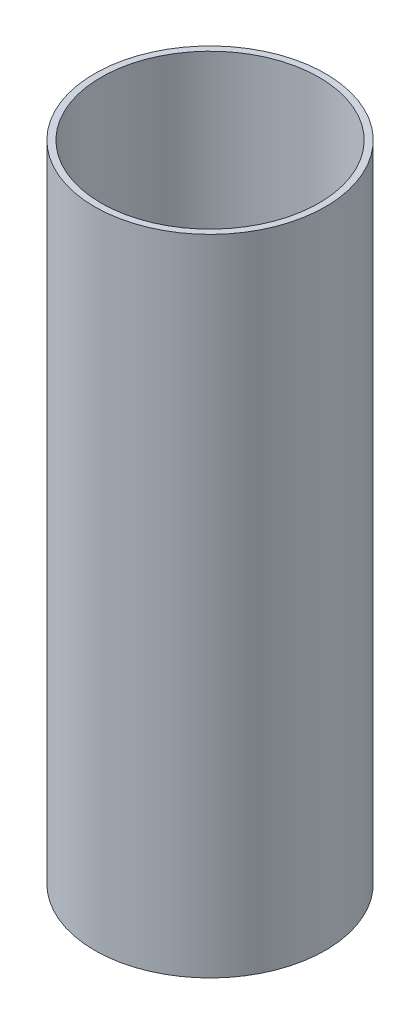
ISO-10303-21;
HEADER;
FILE_DESCRIPTION(('STEP AP214'),'2;1');
FILE_NAME('part.step','',(''),(''),'','','');
FILE_SCHEMA(('AUTOMOTIVE_DESIGN { 1 0 10303 214 1 1 1 1 }'));
ENDSEC;
DATA;
#1=APPLICATION_CONTEXT('core data for automotive mechanical design processes');
#2=APPLICATION_PROTOCOL_DEFINITION('international standard','automotive_design',2000,#1);
#3=PRODUCT_CONTEXT('',#1,'mechanical');
#4=PRODUCT('Part','Part','',(#3));
#5=PRODUCT_RELATED_PRODUCT_CATEGORY('part','',(#4));
#6=PRODUCT_DEFINITION_FORMATION('','',#4);
#7=PRODUCT_DEFINITION_CONTEXT('part definition',#1,'design');
#8=PRODUCT_DEFINITION('design','',#6,#7);
#9=PRODUCT_DEFINITION_SHAPE('','',#8);
#10=(LENGTH_UNIT() NAMED_UNIT(*) SI_UNIT(.MILLI.,.METRE.));
#11=(NAMED_UNIT(*) PLANE_ANGLE_UNIT() SI_UNIT($,.RADIAN.));
#12=(NAMED_UNIT(*) SI_UNIT($,.STERADIAN.) SOLID_ANGLE_UNIT());
#13=UNCERTAINTY_MEASURE_WITH_UNIT(LENGTH_MEASURE(1.E-05),#10,'distance_accuracy_value','');
#14=(GEOMETRIC_REPRESENTATION_CONTEXT(3) GLOBAL_UNCERTAINTY_ASSIGNED_CONTEXT((#13)) GLOBAL_UNIT_ASSIGNED_CONTEXT((#10,
#11,#12)) REPRESENTATION_CONTEXT('',''));
#15=CARTESIAN_POINT('',(0.,0.,0.));
#16=DIRECTION('',(0.,0.,1.));
#17=DIRECTION('',(1.,0.,0.));
#18=AXIS2_PLACEMENT_3D('',#15,#16,#17);
#19=CARTESIAN_POINT('',(0.,159.4485,0.));
#20=DIRECTION('',(0.,1.,0.));
#21=DIRECTION('',(0.,0.,1.));
#22=AXIS2_PLACEMENT_3D('',#19,#20,#21);
#23=PLANE('',#22);
#24=CARTESIAN_POINT('',(0.,159.4485,0.));
#25=DIRECTION('',(0.,1.,0.));
#26=DIRECTION('',(0.,0.,1.));
#27=AXIS2_PLACEMENT_3D('',#24,#25,#26);
#28=CIRCLE('',#27,28.575);
#29=CARTESIAN_POINT('',(0.,159.4485,28.575));
#30=VERTEX_POINT('',#29);
#31=EDGE_CURVE('E10',#30,#30,#28,.T.);
#32=ORIENTED_EDGE('',*,*,#31,.T.);
#33=EDGE_LOOP('',(#32));
#34=FACE_BOUND('',#33,.T.);
#35=CARTESIAN_POINT('',(0.,159.4485,0.));
#36=DIRECTION('',(0.,1.,0.));
#37=DIRECTION('',(0.,0.,1.));
#38=AXIS2_PLACEMENT_3D('',#35,#36,#37);
#39=CIRCLE('',#38,26.9875);
#40=CARTESIAN_POINT('',(0.,159.4485,26.9875));
#41=VERTEX_POINT('',#40);
#42=EDGE_CURVE('E45',#41,#41,#39,.T.);
#43=ORIENTED_EDGE('',*,*,#42,.F.);
#44=EDGE_LOOP('',(#43));
#45=FACE_BOUND('',#44,.T.);
#46=ADVANCED_FACE('F34',(#34,#45),#23,.T.);
#47=CARTESIAN_POINT('',(0.,0.,0.));
#48=DIRECTION('',(0.,1.,0.));
#49=DIRECTION('',(0.,0.,1.));
#50=AXIS2_PLACEMENT_3D('',#47,#48,#49);
#51=PLANE('',#50);
#52=CARTESIAN_POINT('',(0.,0.,0.));
#53=DIRECTION('',(0.,1.,0.));
#54=DIRECTION('',(0.,0.,1.));
#55=AXIS2_PLACEMENT_3D('',#52,#53,#54);
#56=CIRCLE('',#55,28.575);
#57=CARTESIAN_POINT('',(0.,0.,28.575));
#58=VERTEX_POINT('',#57);
#59=EDGE_CURVE('E38',#58,#58,#56,.T.);
#60=ORIENTED_EDGE('',*,*,#59,.F.);
#61=EDGE_LOOP('',(#60));
#62=FACE_BOUND('',#61,.T.);
#63=CARTESIAN_POINT('',(0.,0.,0.));
#64=DIRECTION('',(0.,1.,0.));
#65=DIRECTION('',(0.,0.,1.));
#66=AXIS2_PLACEMENT_3D('',#63,#64,#65);
#67=CIRCLE('',#66,26.9875);
#68=CARTESIAN_POINT('',(0.,0.,26.9875));
#69=VERTEX_POINT('',#68);
#70=EDGE_CURVE('E47',#69,#69,#67,.T.);
#71=ORIENTED_EDGE('',*,*,#70,.T.);
#72=EDGE_LOOP('',(#71));
#73=FACE_BOUND('',#72,.T.);
#74=ADVANCED_FACE('F57',(#62,#73),#51,.F.);
#75=CARTESIAN_POINT('',(0.,159.4485,0.));
#76=DIRECTION('',(0.,-1.,0.));
#77=DIRECTION('',(0.,0.,-1.));
#78=AXIS2_PLACEMENT_3D('',#75,#76,#77);
#79=CYLINDRICAL_SURFACE('',#78,28.575);
#80=ORIENTED_EDGE('',*,*,#31,.F.);
#81=EDGE_LOOP('',(#80));
#82=FACE_BOUND('',#81,.T.);
#83=ORIENTED_EDGE('',*,*,#59,.T.);
#84=EDGE_LOOP('',(#83));
#85=FACE_BOUND('',#84,.T.);
#86=ADVANCED_FACE('F36',(#82,#85),#79,.T.);
#87=CARTESIAN_POINT('',(0.,159.4485,0.));
#88=DIRECTION('',(0.,-1.,0.));
#89=DIRECTION('',(0.,0.,-1.));
#90=AXIS2_PLACEMENT_3D('',#87,#88,#89);
#91=CYLINDRICAL_SURFACE('',#90,26.9875);
#92=ORIENTED_EDGE('',*,*,#42,.T.);
#93=EDGE_LOOP('',(#92));
#94=FACE_BOUND('',#93,.T.);
#95=ORIENTED_EDGE('',*,*,#70,.F.);
#96=EDGE_LOOP('',(#95));
#97=FACE_BOUND('',#96,.T.);
#98=ADVANCED_FACE('F53',(#94,#97),#91,.F.);
#99=CLOSED_SHELL('',(#46,#74,#86,#98));
#100=MANIFOLD_SOLID_BREP('B2',#99);
#101=ADVANCED_BREP_SHAPE_REPRESENTATION('',(#18,#100),#14);
#102=SHAPE_DEFINITION_REPRESENTATION(#9,#101);
ENDSEC;
END-ISO-10303-21;
